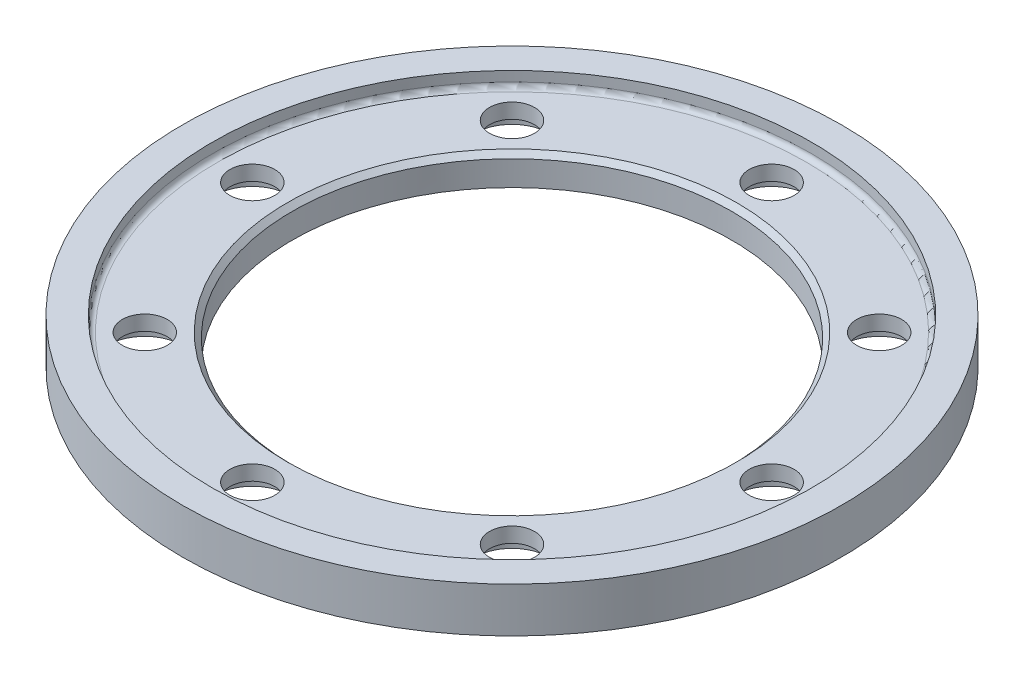
ISO-10303-21;
HEADER;
FILE_DESCRIPTION(('STEP AP214'),'2;1');
FILE_NAME('part.step','',(''),(''),'','','');
FILE_SCHEMA(('AUTOMOTIVE_DESIGN { 1 0 10303 214 1 1 1 1 }'));
ENDSEC;
DATA;
#1=APPLICATION_CONTEXT('core data for automotive mechanical design processes');
#2=APPLICATION_PROTOCOL_DEFINITION('international standard','automotive_design',2000,#1);
#3=PRODUCT_CONTEXT('',#1,'mechanical');
#4=PRODUCT('Part','Part','',(#3));
#5=PRODUCT_RELATED_PRODUCT_CATEGORY('part','',(#4));
#6=PRODUCT_DEFINITION_FORMATION('','',#4);
#7=PRODUCT_DEFINITION_CONTEXT('part definition',#1,'design');
#8=PRODUCT_DEFINITION('design','',#6,#7);
#9=PRODUCT_DEFINITION_SHAPE('','',#8);
#10=(LENGTH_UNIT() NAMED_UNIT(*) SI_UNIT(.MILLI.,.METRE.));
#11=(NAMED_UNIT(*) PLANE_ANGLE_UNIT() SI_UNIT($,.RADIAN.));
#12=(NAMED_UNIT(*) SI_UNIT($,.STERADIAN.) SOLID_ANGLE_UNIT());
#13=UNCERTAINTY_MEASURE_WITH_UNIT(LENGTH_MEASURE(1.E-05),#10,'distance_accuracy_value','');
#14=(GEOMETRIC_REPRESENTATION_CONTEXT(3) GLOBAL_UNCERTAINTY_ASSIGNED_CONTEXT((#13)) GLOBAL_UNIT_ASSIGNED_CONTEXT((#10,
#11,#12)) REPRESENTATION_CONTEXT('',''));
#15=CARTESIAN_POINT('',(0.,0.,0.));
#16=DIRECTION('',(0.,0.,1.));
#17=DIRECTION('',(1.,0.,0.));
#18=AXIS2_PLACEMENT_3D('',#15,#16,#17);
#19=CARTESIAN_POINT('',(22.,4.49999999999998,0.));
#20=DIRECTION('',(0.,1.,0.));
#21=DIRECTION('',(0.,0.,1.));
#22=AXIS2_PLACEMENT_3D('',#19,#20,#21);
#23=PLANE('',#22);
#24=CARTESIAN_POINT('',(0.,4.49999999999998,0.));
#25=DIRECTION('',(0.,1.,0.));
#26=DIRECTION('',(0.,0.,1.));
#27=AXIS2_PLACEMENT_3D('',#24,#25,#26);
#28=CIRCLE('',#27,33.);
#29=CARTESIAN_POINT('',(0.,4.49999999999998,33.));
#30=VERTEX_POINT('',#29);
#31=EDGE_CURVE('E109',#30,#30,#28,.T.);
#32=ORIENTED_EDGE('',*,*,#31,.F.);
#33=EDGE_LOOP('',(#32));
#34=FACE_BOUND('',#33,.T.);
#35=CARTESIAN_POINT('',(0.,4.49999999999998,0.));
#36=DIRECTION('',(0.,1.,0.));
#37=DIRECTION('',(0.,0.,1.));
#38=AXIS2_PLACEMENT_3D('',#35,#36,#37);
#39=CIRCLE('',#38,22.);
#40=CARTESIAN_POINT('',(0.,4.49999999999998,22.));
#41=VERTEX_POINT('',#40);
#42=EDGE_CURVE('E66',#41,#41,#39,.T.);
#43=ORIENTED_EDGE('',*,*,#42,.T.);
#44=EDGE_LOOP('',(#43));
#45=FACE_BOUND('',#44,.T.);
#46=CARTESIAN_POINT('',(18.3847763108463,4.49999999999998,-18.3847763108542));
#47=DIRECTION('',(0.,-1.,0.));
#48=DIRECTION('',(0.,0.,-1.));
#49=AXIS2_PLACEMENT_3D('',#46,#47,#48);
#50=CIRCLE('',#49,3.75);
#51=CARTESIAN_POINT('',(18.3847763108463,4.49999999999998,-22.1347763108542));
#52=VERTEX_POINT('',#51);
#53=EDGE_CURVE('E75',#52,#52,#50,.T.);
#54=ORIENTED_EDGE('',*,*,#53,.F.);
#55=EDGE_LOOP('',(#54));
#56=FACE_BOUND('',#55,.T.);
#57=CARTESIAN_POINT('',(26.,4.49999999999998,-4.81889118717568E-12));
#58=DIRECTION('',(0.,-1.,0.));
#59=DIRECTION('',(0.,0.,-1.));
#60=AXIS2_PLACEMENT_3D('',#57,#58,#59);
#61=CIRCLE('',#60,3.75);
#62=CARTESIAN_POINT('',(26.,4.49999999999998,-3.75000000000482));
#63=VERTEX_POINT('',#62);
#64=EDGE_CURVE('E80',#63,#63,#61,.T.);
#65=ORIENTED_EDGE('',*,*,#64,.F.);
#66=EDGE_LOOP('',(#65));
#67=FACE_BOUND('',#66,.T.);
#68=CARTESIAN_POINT('',(18.3847763108531,4.49999999999998,18.3847763108474));
#69=DIRECTION('',(0.,-1.,0.));
#70=DIRECTION('',(0.,0.,-1.));
#71=AXIS2_PLACEMENT_3D('',#68,#69,#70);
#72=CIRCLE('',#71,3.75);
#73=CARTESIAN_POINT('',(18.3847763108531,4.49999999999998,14.6347763108474));
#74=VERTEX_POINT('',#73);
#75=EDGE_CURVE('E85',#74,#74,#72,.T.);
#76=ORIENTED_EDGE('',*,*,#75,.F.);
#77=EDGE_LOOP('',(#76));
#78=FACE_BOUND('',#77,.T.);
#79=CARTESIAN_POINT('',(3.21554482361645E-12,4.49999999999998,26.));
#80=DIRECTION('',(0.,-1.,0.));
#81=DIRECTION('',(0.,0.,-1.));
#82=AXIS2_PLACEMENT_3D('',#79,#80,#81);
#83=CIRCLE('',#82,3.75);
#84=CARTESIAN_POINT('',(3.21554482361645E-12,4.49999999999998,22.25));
#85=VERTEX_POINT('',#84);
#86=EDGE_CURVE('E90',#85,#85,#83,.T.);
#87=ORIENTED_EDGE('',*,*,#86,.F.);
#88=EDGE_LOOP('',(#87));
#89=FACE_BOUND('',#88,.T.);
#90=CARTESIAN_POINT('',(-18.3847763108485,4.49999999999998,18.3847763108519));
#91=DIRECTION('',(0.,-1.,0.));
#92=DIRECTION('',(0.,0.,-1.));
#93=AXIS2_PLACEMENT_3D('',#90,#91,#92);
#94=CIRCLE('',#93,3.75);
#95=CARTESIAN_POINT('',(-18.3847763108485,4.49999999999998,14.6347763108519));
#96=VERTEX_POINT('',#95);
#97=EDGE_CURVE('E95',#96,#96,#94,.T.);
#98=ORIENTED_EDGE('',*,*,#97,.F.);
#99=EDGE_LOOP('',(#98));
#100=FACE_BOUND('',#99,.T.);
#101=CARTESIAN_POINT('',(-26.,4.49999999999998,1.60642530032916E-12));
#102=DIRECTION('',(0.,-1.,0.));
#103=DIRECTION('',(0.,0.,-1.));
#104=AXIS2_PLACEMENT_3D('',#101,#102,#103);
#105=CIRCLE('',#104,3.75);
#106=CARTESIAN_POINT('',(-26.,4.49999999999998,-3.74999999999839));
#107=VERTEX_POINT('',#106);
#108=EDGE_CURVE('E100',#107,#107,#105,.T.);
#109=ORIENTED_EDGE('',*,*,#108,.F.);
#110=EDGE_LOOP('',(#109));
#111=FACE_BOUND('',#110,.T.);
#112=CARTESIAN_POINT('',(-18.3847763108508,4.49999999999998,-18.3847763108497));
#113=DIRECTION('',(0.,-1.,0.));
#114=DIRECTION('',(0.,0.,-1.));
#115=AXIS2_PLACEMENT_3D('',#112,#113,#114);
#116=CIRCLE('',#115,3.75);
#117=CARTESIAN_POINT('',(-18.3847763108508,4.49999999999998,-22.1347763108497));
#118=VERTEX_POINT('',#117);
#119=EDGE_CURVE('E105',#118,#118,#116,.T.);
#120=ORIENTED_EDGE('',*,*,#119,.F.);
#121=EDGE_LOOP('',(#120));
#122=FACE_BOUND('',#121,.T.);
#123=CARTESIAN_POINT('',(0.,4.49999999999998,-26.));
#124=DIRECTION('',(0.,-1.,0.));
#125=DIRECTION('',(0.,0.,-1.));
#126=AXIS2_PLACEMENT_3D('',#123,#124,#125);
#127=CIRCLE('',#126,3.75);
#128=CARTESIAN_POINT('',(0.,4.49999999999998,-29.75));
#129=VERTEX_POINT('',#128);
#130=EDGE_CURVE('E171',#129,#129,#127,.T.);
#131=ORIENTED_EDGE('',*,*,#130,.F.);
#132=EDGE_LOOP('',(#131));
#133=FACE_BOUND('',#132,.T.);
#134=ADVANCED_FACE('F45',(#34,#45,#56,#67,#78,#89,#100,#111,#122,#133),#23,.F.);
#135=CARTESIAN_POINT('',(30.,7.49999999999998,0.));
#136=DIRECTION('',(0.,-1.,0.));
#137=DIRECTION('',(0.,0.,-1.));
#138=AXIS2_PLACEMENT_3D('',#135,#136,#137);
#139=PLANE('',#138);
#140=CARTESIAN_POINT('',(0.,7.49999999999998,0.));
#141=DIRECTION('',(0.,-1.,0.));
#142=DIRECTION('',(0.,0.,-1.));
#143=AXIS2_PLACEMENT_3D('',#140,#141,#142);
#144=CIRCLE('',#143,22.5);
#145=CARTESIAN_POINT('',(0.,7.49999999999998,-22.5));
#146=VERTEX_POINT('',#145);
#147=EDGE_CURVE('E10',#146,#146,#144,.T.);
#148=ORIENTED_EDGE('',*,*,#147,.T.);
#149=EDGE_LOOP('',(#148));
#150=FACE_BOUND('',#149,.T.);
#151=CARTESIAN_POINT('',(0.,7.49999999999998,0.));
#152=DIRECTION('',(0.,-1.,0.));
#153=DIRECTION('',(0.,0.,-1.));
#154=AXIS2_PLACEMENT_3D('',#151,#152,#153);
#155=CIRCLE('',#154,29.5);
#156=CARTESIAN_POINT('',(0.,7.49999999999998,-29.5));
#157=VERTEX_POINT('',#156);
#158=EDGE_CURVE('E61',#157,#157,#155,.F.);
#159=ORIENTED_EDGE('',*,*,#158,.T.);
#160=EDGE_LOOP('',(#159));
#161=FACE_BOUND('',#160,.T.);
#162=CARTESIAN_POINT('',(0.,7.49999999999998,-26.));
#163=DIRECTION('',(0.,-1.,0.));
#164=DIRECTION('',(0.,0.,-1.));
#165=AXIS2_PLACEMENT_3D('',#162,#163,#164);
#166=CIRCLE('',#165,2.25);
#167=CARTESIAN_POINT('',(0.,7.49999999999998,-28.25));
#168=VERTEX_POINT('',#167);
#169=EDGE_CURVE('E102',#168,#168,#166,.T.);
#170=ORIENTED_EDGE('',*,*,#169,.T.);
#171=EDGE_LOOP('',(#170));
#172=FACE_BOUND('',#171,.T.);
#173=CARTESIAN_POINT('',(-18.3847763108508,7.49999999999998,-18.3847763108497));
#174=DIRECTION('',(0.,-1.,0.));
#175=DIRECTION('',(0.,0.,-1.));
#176=AXIS2_PLACEMENT_3D('',#173,#174,#175);
#177=CIRCLE('',#176,2.25);
#178=CARTESIAN_POINT('',(-18.3847763108508,7.49999999999998,-20.6347763108497));
#179=VERTEX_POINT('',#178);
#180=EDGE_CURVE('E97',#179,#179,#177,.T.);
#181=ORIENTED_EDGE('',*,*,#180,.T.);
#182=EDGE_LOOP('',(#181));
#183=FACE_BOUND('',#182,.T.);
#184=CARTESIAN_POINT('',(-26.,7.49999999999998,1.60642530032916E-12));
#185=DIRECTION('',(0.,-1.,0.));
#186=DIRECTION('',(0.,0.,-1.));
#187=AXIS2_PLACEMENT_3D('',#184,#185,#186);
#188=CIRCLE('',#187,2.25);
#189=CARTESIAN_POINT('',(-26.,7.49999999999998,-2.24999999999839));
#190=VERTEX_POINT('',#189);
#191=EDGE_CURVE('E92',#190,#190,#188,.T.);
#192=ORIENTED_EDGE('',*,*,#191,.T.);
#193=EDGE_LOOP('',(#192));
#194=FACE_BOUND('',#193,.T.);
#195=CARTESIAN_POINT('',(-18.3847763108485,7.49999999999998,18.3847763108519));
#196=DIRECTION('',(0.,-1.,0.));
#197=DIRECTION('',(0.,0.,-1.));
#198=AXIS2_PLACEMENT_3D('',#195,#196,#197);
#199=CIRCLE('',#198,2.25);
#200=CARTESIAN_POINT('',(-18.3847763108485,7.49999999999998,16.1347763108519));
#201=VERTEX_POINT('',#200);
#202=EDGE_CURVE('E87',#201,#201,#199,.T.);
#203=ORIENTED_EDGE('',*,*,#202,.T.);
#204=EDGE_LOOP('',(#203));
#205=FACE_BOUND('',#204,.T.);
#206=CARTESIAN_POINT('',(3.21554482361645E-12,7.49999999999998,26.));
#207=DIRECTION('',(0.,-1.,0.));
#208=DIRECTION('',(0.,0.,-1.));
#209=AXIS2_PLACEMENT_3D('',#206,#207,#208);
#210=CIRCLE('',#209,2.25);
#211=CARTESIAN_POINT('',(3.21554482361645E-12,7.49999999999998,23.75));
#212=VERTEX_POINT('',#211);
#213=EDGE_CURVE('E82',#212,#212,#210,.T.);
#214=ORIENTED_EDGE('',*,*,#213,.T.);
#215=EDGE_LOOP('',(#214));
#216=FACE_BOUND('',#215,.T.);
#217=CARTESIAN_POINT('',(18.3847763108531,7.49999999999998,18.3847763108474));
#218=DIRECTION('',(0.,-1.,0.));
#219=DIRECTION('',(0.,0.,-1.));
#220=AXIS2_PLACEMENT_3D('',#217,#218,#219);
#221=CIRCLE('',#220,2.25);
#222=CARTESIAN_POINT('',(18.3847763108531,7.49999999999998,16.1347763108474));
#223=VERTEX_POINT('',#222);
#224=EDGE_CURVE('E77',#223,#223,#221,.T.);
#225=ORIENTED_EDGE('',*,*,#224,.T.);
#226=EDGE_LOOP('',(#225));
#227=FACE_BOUND('',#226,.T.);
#228=CARTESIAN_POINT('',(26.,7.49999999999998,-4.81889118717568E-12));
#229=DIRECTION('',(0.,-1.,0.));
#230=DIRECTION('',(0.,0.,-1.));
#231=AXIS2_PLACEMENT_3D('',#228,#229,#230);
#232=CIRCLE('',#231,2.25);
#233=CARTESIAN_POINT('',(26.,7.49999999999998,-2.25000000000482));
#234=VERTEX_POINT('',#233);
#235=EDGE_CURVE('E72',#234,#234,#232,.T.);
#236=ORIENTED_EDGE('',*,*,#235,.T.);
#237=EDGE_LOOP('',(#236));
#238=FACE_BOUND('',#237,.T.);
#239=CARTESIAN_POINT('',(18.3847763108463,7.49999999999998,-18.3847763108542));
#240=DIRECTION('',(0.,-1.,0.));
#241=DIRECTION('',(0.,0.,-1.));
#242=AXIS2_PLACEMENT_3D('',#239,#240,#241);
#243=CIRCLE('',#242,2.25);
#244=CARTESIAN_POINT('',(18.3847763108463,7.49999999999998,-20.6347763108542));
#245=VERTEX_POINT('',#244);
#246=EDGE_CURVE('E67',#245,#245,#243,.T.);
#247=ORIENTED_EDGE('',*,*,#246,.T.);
#248=EDGE_LOOP('',(#247));
#249=FACE_BOUND('',#248,.T.);
#250=ADVANCED_FACE('F178',(#150,#161,#172,#183,#194,#205,#216,#227,#238,#249),#139,.F.);
#251=CARTESIAN_POINT('',(0.,182.378600126775,0.));
#252=DIRECTION('',(0.,1.,0.));
#253=DIRECTION('',(0.,0.,1.));
#254=AXIS2_PLACEMENT_3D('',#251,#252,#253);
#255=CYLINDRICAL_SURFACE('',#254,22.);
#256=CARTESIAN_POINT('',(0.,6.99999999999995,0.));
#257=DIRECTION('',(0.,-1.,0.));
#258=DIRECTION('',(0.,0.,-1.));
#259=AXIS2_PLACEMENT_3D('',#256,#257,#258);
#260=CIRCLE('',#259,22.);
#261=CARTESIAN_POINT('',(0.,6.99999999999995,-22.));
#262=VERTEX_POINT('',#261);
#263=EDGE_CURVE('E53',#262,#262,#260,.F.);
#264=ORIENTED_EDGE('',*,*,#263,.T.);
#265=EDGE_LOOP('',(#264));
#266=FACE_BOUND('',#265,.T.);
#267=ORIENTED_EDGE('',*,*,#42,.F.);
#268=EDGE_LOOP('',(#267));
#269=FACE_BOUND('',#268,.T.);
#270=ADVANCED_FACE('F186',(#266,#269),#255,.F.);
#271=CARTESIAN_POINT('',(0.,182.378600126775,0.));
#272=DIRECTION('',(0.,1.,0.));
#273=DIRECTION('',(0.,0.,1.));
#274=AXIS2_PLACEMENT_3D('',#271,#272,#273);
#275=CYLINDRICAL_SURFACE('',#274,33.);
#276=CARTESIAN_POINT('',(0.,8.99999999999998,0.));
#277=DIRECTION('',(0.,1.,0.));
#278=DIRECTION('',(0.,0.,1.));
#279=AXIS2_PLACEMENT_3D('',#276,#277,#278);
#280=CIRCLE('',#279,33.);
#281=CARTESIAN_POINT('',(0.,8.99999999999998,33.));
#282=VERTEX_POINT('',#281);
#283=EDGE_CURVE('E112',#282,#282,#280,.T.);
#284=ORIENTED_EDGE('',*,*,#283,.F.);
#285=EDGE_LOOP('',(#284));
#286=FACE_BOUND('',#285,.T.);
#287=ORIENTED_EDGE('',*,*,#31,.T.);
#288=EDGE_LOOP('',(#287));
#289=FACE_BOUND('',#288,.T.);
#290=ADVANCED_FACE('F192',(#286,#289),#275,.T.);
#291=CARTESIAN_POINT('',(33.,8.99999999999998,0.));
#292=DIRECTION('',(0.,-1.,0.));
#293=DIRECTION('',(0.,0.,-1.));
#294=AXIS2_PLACEMENT_3D('',#291,#292,#293);
#295=PLANE('',#294);
#296=CARTESIAN_POINT('',(0.,8.99999999999998,0.));
#297=DIRECTION('',(0.,1.,0.));
#298=DIRECTION('',(0.,0.,1.));
#299=AXIS2_PLACEMENT_3D('',#296,#297,#298);
#300=CIRCLE('',#299,30.);
#301=CARTESIAN_POINT('',(0.,8.99999999999998,30.));
#302=VERTEX_POINT('',#301);
#303=EDGE_CURVE('E70',#302,#302,#300,.T.);
#304=ORIENTED_EDGE('',*,*,#303,.F.);
#305=EDGE_LOOP('',(#304));
#306=FACE_BOUND('',#305,.T.);
#307=ORIENTED_EDGE('',*,*,#283,.T.);
#308=EDGE_LOOP('',(#307));
#309=FACE_BOUND('',#308,.T.);
#310=ADVANCED_FACE('F343',(#306,#309),#295,.F.);
#311=CARTESIAN_POINT('',(0.,182.378600126775,0.));
#312=DIRECTION('',(0.,1.,0.));
#313=DIRECTION('',(0.,0.,1.));
#314=AXIS2_PLACEMENT_3D('',#311,#312,#313);
#315=CYLINDRICAL_SURFACE('',#314,30.);
#316=CARTESIAN_POINT('',(0.,7.99999999999998,0.));
#317=DIRECTION('',(0.,-1.,0.));
#318=DIRECTION('',(0.,0.,-1.));
#319=AXIS2_PLACEMENT_3D('',#316,#317,#318);
#320=CIRCLE('',#319,30.);
#321=CARTESIAN_POINT('',(0.,7.99999999999998,-30.));
#322=VERTEX_POINT('',#321);
#323=EDGE_CURVE('E57',#322,#322,#320,.T.);
#324=ORIENTED_EDGE('',*,*,#323,.T.);
#325=EDGE_LOOP('',(#324));
#326=FACE_BOUND('',#325,.T.);
#327=ORIENTED_EDGE('',*,*,#303,.T.);
#328=EDGE_LOOP('',(#327));
#329=FACE_BOUND('',#328,.T.);
#330=ADVANCED_FACE('F232',(#326,#329),#315,.F.);
#331=CARTESIAN_POINT('',(18.3847763108463,4.49999999999998,-18.3847763108542));
#332=DIRECTION('',(0.,-1.,0.));
#333=DIRECTION('',(0.,0.,-1.));
#334=AXIS2_PLACEMENT_3D('',#331,#332,#333);
#335=CYLINDRICAL_SURFACE('',#334,2.25);
#336=ORIENTED_EDGE('',*,*,#246,.F.);
#337=EDGE_LOOP('',(#336));
#338=FACE_BOUND('',#337,.T.);
#339=CARTESIAN_POINT('',(18.3847763108463,5.99999999999998,-18.3847763108542));
#340=DIRECTION('',(0.,-1.,0.));
#341=DIRECTION('',(0.,0.,-1.));
#342=AXIS2_PLACEMENT_3D('',#339,#340,#341);
#343=CIRCLE('',#342,2.25);
#344=CARTESIAN_POINT('',(18.3847763108463,5.99999999999998,-20.6347763108542));
#345=VERTEX_POINT('',#344);
#346=EDGE_CURVE('E71',#345,#345,#343,.T.);
#347=ORIENTED_EDGE('',*,*,#346,.T.);
#348=EDGE_LOOP('',(#347));
#349=FACE_BOUND('',#348,.T.);
#350=ADVANCED_FACE('F228',(#338,#349),#335,.F.);
#351=CARTESIAN_POINT('',(20.6347763108463,5.99999999999998,-18.3847763108542));
#352=DIRECTION('',(0.,1.,0.));
#353=DIRECTION('',(0.,0.,1.));
#354=AXIS2_PLACEMENT_3D('',#351,#352,#353);
#355=PLANE('',#354);
#356=ORIENTED_EDGE('',*,*,#346,.F.);
#357=EDGE_LOOP('',(#356));
#358=FACE_BOUND('',#357,.T.);
#359=CARTESIAN_POINT('',(18.3847763108463,5.99999999999998,-18.3847763108542));
#360=DIRECTION('',(0.,-1.,0.));
#361=DIRECTION('',(0.,0.,-1.));
#362=AXIS2_PLACEMENT_3D('',#359,#360,#361);
#363=CIRCLE('',#362,3.75);
#364=CARTESIAN_POINT('',(18.3847763108463,5.99999999999998,-22.1347763108542));
#365=VERTEX_POINT('',#364);
#366=EDGE_CURVE('E119',#365,#365,#363,.T.);
#367=ORIENTED_EDGE('',*,*,#366,.T.);
#368=EDGE_LOOP('',(#367));
#369=FACE_BOUND('',#368,.T.);
#370=ADVANCED_FACE('F231',(#358,#369),#355,.F.);
#371=CARTESIAN_POINT('',(18.3847763108463,4.49999999999998,-18.3847763108542));
#372=DIRECTION('',(0.,-1.,0.));
#373=DIRECTION('',(0.,0.,-1.));
#374=AXIS2_PLACEMENT_3D('',#371,#372,#373);
#375=CYLINDRICAL_SURFACE('',#374,3.75);
#376=ORIENTED_EDGE('',*,*,#366,.F.);
#377=EDGE_LOOP('',(#376));
#378=FACE_BOUND('',#377,.T.);
#379=ORIENTED_EDGE('',*,*,#53,.T.);
#380=EDGE_LOOP('',(#379));
#381=FACE_BOUND('',#380,.T.);
#382=ADVANCED_FACE('F238',(#378,#381),#375,.F.);
#383=CARTESIAN_POINT('',(26.,4.49999999999998,-4.81889118717568E-12));
#384=DIRECTION('',(0.,-1.,0.));
#385=DIRECTION('',(0.,0.,-1.));
#386=AXIS2_PLACEMENT_3D('',#383,#384,#385);
#387=CYLINDRICAL_SURFACE('',#386,2.25);
#388=ORIENTED_EDGE('',*,*,#235,.F.);
#389=EDGE_LOOP('',(#388));
#390=FACE_BOUND('',#389,.T.);
#391=CARTESIAN_POINT('',(26.,5.99999999999998,-4.81889118717568E-12));
#392=DIRECTION('',(0.,-1.,0.));
#393=DIRECTION('',(0.,0.,-1.));
#394=AXIS2_PLACEMENT_3D('',#391,#392,#393);
#395=CIRCLE('',#394,2.25);
#396=CARTESIAN_POINT('',(26.,5.99999999999998,-2.25000000000482));
#397=VERTEX_POINT('',#396);
#398=EDGE_CURVE('E76',#397,#397,#395,.T.);
#399=ORIENTED_EDGE('',*,*,#398,.T.);
#400=EDGE_LOOP('',(#399));
#401=FACE_BOUND('',#400,.T.);
#402=ADVANCED_FACE('F244',(#390,#401),#387,.F.);
#403=CARTESIAN_POINT('',(28.25,5.99999999999998,-4.81889118717568E-12));
#404=DIRECTION('',(0.,1.,0.));
#405=DIRECTION('',(0.,0.,1.));
#406=AXIS2_PLACEMENT_3D('',#403,#404,#405);
#407=PLANE('',#406);
#408=ORIENTED_EDGE('',*,*,#398,.F.);
#409=EDGE_LOOP('',(#408));
#410=FACE_BOUND('',#409,.T.);
#411=CARTESIAN_POINT('',(26.,5.99999999999998,-4.81889118717568E-12));
#412=DIRECTION('',(0.,-1.,0.));
#413=DIRECTION('',(0.,0.,-1.));
#414=AXIS2_PLACEMENT_3D('',#411,#412,#413);
#415=CIRCLE('',#414,3.75);
#416=CARTESIAN_POINT('',(26.,5.99999999999998,-3.75000000000482));
#417=VERTEX_POINT('',#416);
#418=EDGE_CURVE('E126',#417,#417,#415,.T.);
#419=ORIENTED_EDGE('',*,*,#418,.T.);
#420=EDGE_LOOP('',(#419));
#421=FACE_BOUND('',#420,.T.);
#422=ADVANCED_FACE('F334',(#410,#421),#407,.F.);
#423=CARTESIAN_POINT('',(26.,4.49999999999998,-4.81889118717568E-12));
#424=DIRECTION('',(0.,-1.,0.));
#425=DIRECTION('',(0.,0.,-1.));
#426=AXIS2_PLACEMENT_3D('',#423,#424,#425);
#427=CYLINDRICAL_SURFACE('',#426,3.75);
#428=ORIENTED_EDGE('',*,*,#418,.F.);
#429=EDGE_LOOP('',(#428));
#430=FACE_BOUND('',#429,.T.);
#431=ORIENTED_EDGE('',*,*,#64,.T.);
#432=EDGE_LOOP('',(#431));
#433=FACE_BOUND('',#432,.T.);
#434=ADVANCED_FACE('F330',(#430,#433),#427,.F.);
#435=CARTESIAN_POINT('',(18.3847763108531,4.49999999999998,18.3847763108474));
#436=DIRECTION('',(0.,-1.,0.));
#437=DIRECTION('',(0.,0.,-1.));
#438=AXIS2_PLACEMENT_3D('',#435,#436,#437);
#439=CYLINDRICAL_SURFACE('',#438,2.25);
#440=ORIENTED_EDGE('',*,*,#224,.F.);
#441=EDGE_LOOP('',(#440));
#442=FACE_BOUND('',#441,.T.);
#443=CARTESIAN_POINT('',(18.3847763108531,5.99999999999998,18.3847763108474));
#444=DIRECTION('',(0.,-1.,0.));
#445=DIRECTION('',(0.,0.,-1.));
#446=AXIS2_PLACEMENT_3D('',#443,#444,#445);
#447=CIRCLE('',#446,2.25);
#448=CARTESIAN_POINT('',(18.3847763108531,5.99999999999998,16.1347763108474));
#449=VERTEX_POINT('',#448);
#450=EDGE_CURVE('E81',#449,#449,#447,.T.);
#451=ORIENTED_EDGE('',*,*,#450,.T.);
#452=EDGE_LOOP('',(#451));
#453=FACE_BOUND('',#452,.T.);
#454=ADVANCED_FACE('F326',(#442,#453),#439,.F.);
#455=CARTESIAN_POINT('',(20.6347763108531,5.99999999999998,18.3847763108474));
#456=DIRECTION('',(0.,1.,0.));
#457=DIRECTION('',(0.,0.,1.));
#458=AXIS2_PLACEMENT_3D('',#455,#456,#457);
#459=PLANE('',#458);
#460=ORIENTED_EDGE('',*,*,#450,.F.);
#461=EDGE_LOOP('',(#460));
#462=FACE_BOUND('',#461,.T.);
#463=CARTESIAN_POINT('',(18.3847763108531,5.99999999999998,18.3847763108474));
#464=DIRECTION('',(0.,-1.,0.));
#465=DIRECTION('',(0.,0.,-1.));
#466=AXIS2_PLACEMENT_3D('',#463,#464,#465);
#467=CIRCLE('',#466,3.75);
#468=CARTESIAN_POINT('',(18.3847763108531,5.99999999999998,14.6347763108474));
#469=VERTEX_POINT('',#468);
#470=EDGE_CURVE('E133',#469,#469,#467,.T.);
#471=ORIENTED_EDGE('',*,*,#470,.T.);
#472=EDGE_LOOP('',(#471));
#473=FACE_BOUND('',#472,.T.);
#474=ADVANCED_FACE('F322',(#462,#473),#459,.F.);
#475=CARTESIAN_POINT('',(18.3847763108531,4.49999999999998,18.3847763108474));
#476=DIRECTION('',(0.,-1.,0.));
#477=DIRECTION('',(0.,0.,-1.));
#478=AXIS2_PLACEMENT_3D('',#475,#476,#477);
#479=CYLINDRICAL_SURFACE('',#478,3.75);
#480=ORIENTED_EDGE('',*,*,#470,.F.);
#481=EDGE_LOOP('',(#480));
#482=FACE_BOUND('',#481,.T.);
#483=ORIENTED_EDGE('',*,*,#75,.T.);
#484=EDGE_LOOP('',(#483));
#485=FACE_BOUND('',#484,.T.);
#486=ADVANCED_FACE('F318',(#482,#485),#479,.F.);
#487=CARTESIAN_POINT('',(3.21554482361645E-12,4.49999999999998,26.));
#488=DIRECTION('',(0.,-1.,0.));
#489=DIRECTION('',(0.,0.,-1.));
#490=AXIS2_PLACEMENT_3D('',#487,#488,#489);
#491=CYLINDRICAL_SURFACE('',#490,2.25);
#492=ORIENTED_EDGE('',*,*,#213,.F.);
#493=EDGE_LOOP('',(#492));
#494=FACE_BOUND('',#493,.T.);
#495=CARTESIAN_POINT('',(3.21554482361645E-12,5.99999999999998,26.));
#496=DIRECTION('',(0.,-1.,0.));
#497=DIRECTION('',(0.,0.,-1.));
#498=AXIS2_PLACEMENT_3D('',#495,#496,#497);
#499=CIRCLE('',#498,2.25);
#500=CARTESIAN_POINT('',(3.21554482361645E-12,5.99999999999998,23.75));
#501=VERTEX_POINT('',#500);
#502=EDGE_CURVE('E86',#501,#501,#499,.T.);
#503=ORIENTED_EDGE('',*,*,#502,.T.);
#504=EDGE_LOOP('',(#503));
#505=FACE_BOUND('',#504,.T.);
#506=ADVANCED_FACE('F314',(#494,#505),#491,.F.);
#507=CARTESIAN_POINT('',(2.25000000000322,5.99999999999998,26.));
#508=DIRECTION('',(0.,1.,0.));
#509=DIRECTION('',(0.,0.,1.));
#510=AXIS2_PLACEMENT_3D('',#507,#508,#509);
#511=PLANE('',#510);
#512=ORIENTED_EDGE('',*,*,#502,.F.);
#513=EDGE_LOOP('',(#512));
#514=FACE_BOUND('',#513,.T.);
#515=CARTESIAN_POINT('',(3.21554482361645E-12,5.99999999999998,26.));
#516=DIRECTION('',(0.,-1.,0.));
#517=DIRECTION('',(0.,0.,-1.));
#518=AXIS2_PLACEMENT_3D('',#515,#516,#517);
#519=CIRCLE('',#518,3.75);
#520=CARTESIAN_POINT('',(3.21554482361645E-12,5.99999999999998,22.25));
#521=VERTEX_POINT('',#520);
#522=EDGE_CURVE('E140',#521,#521,#519,.T.);
#523=ORIENTED_EDGE('',*,*,#522,.T.);
#524=EDGE_LOOP('',(#523));
#525=FACE_BOUND('',#524,.T.);
#526=ADVANCED_FACE('F310',(#514,#525),#511,.F.);
#527=CARTESIAN_POINT('',(3.21554482361645E-12,4.49999999999998,26.));
#528=DIRECTION('',(0.,-1.,0.));
#529=DIRECTION('',(0.,0.,-1.));
#530=AXIS2_PLACEMENT_3D('',#527,#528,#529);
#531=CYLINDRICAL_SURFACE('',#530,3.75);
#532=ORIENTED_EDGE('',*,*,#522,.F.);
#533=EDGE_LOOP('',(#532));
#534=FACE_BOUND('',#533,.T.);
#535=ORIENTED_EDGE('',*,*,#86,.T.);
#536=EDGE_LOOP('',(#535));
#537=FACE_BOUND('',#536,.T.);
#538=ADVANCED_FACE('F306',(#534,#537),#531,.F.);
#539=CARTESIAN_POINT('',(-18.3847763108485,4.49999999999998,18.3847763108519));
#540=DIRECTION('',(0.,-1.,0.));
#541=DIRECTION('',(0.,0.,-1.));
#542=AXIS2_PLACEMENT_3D('',#539,#540,#541);
#543=CYLINDRICAL_SURFACE('',#542,2.25);
#544=ORIENTED_EDGE('',*,*,#202,.F.);
#545=EDGE_LOOP('',(#544));
#546=FACE_BOUND('',#545,.T.);
#547=CARTESIAN_POINT('',(-18.3847763108485,5.99999999999998,18.3847763108519));
#548=DIRECTION('',(0.,-1.,0.));
#549=DIRECTION('',(0.,0.,-1.));
#550=AXIS2_PLACEMENT_3D('',#547,#548,#549);
#551=CIRCLE('',#550,2.25);
#552=CARTESIAN_POINT('',(-18.3847763108485,5.99999999999998,16.1347763108519));
#553=VERTEX_POINT('',#552);
#554=EDGE_CURVE('E91',#553,#553,#551,.T.);
#555=ORIENTED_EDGE('',*,*,#554,.T.);
#556=EDGE_LOOP('',(#555));
#557=FACE_BOUND('',#556,.T.);
#558=ADVANCED_FACE('F302',(#546,#557),#543,.F.);
#559=CARTESIAN_POINT('',(-16.1347763108485,5.99999999999998,18.3847763108519));
#560=DIRECTION('',(0.,1.,0.));
#561=DIRECTION('',(0.,0.,1.));
#562=AXIS2_PLACEMENT_3D('',#559,#560,#561);
#563=PLANE('',#562);
#564=ORIENTED_EDGE('',*,*,#554,.F.);
#565=EDGE_LOOP('',(#564));
#566=FACE_BOUND('',#565,.T.);
#567=CARTESIAN_POINT('',(-18.3847763108485,5.99999999999998,18.3847763108519));
#568=DIRECTION('',(0.,-1.,0.));
#569=DIRECTION('',(0.,0.,-1.));
#570=AXIS2_PLACEMENT_3D('',#567,#568,#569);
#571=CIRCLE('',#570,3.75);
#572=CARTESIAN_POINT('',(-18.3847763108485,5.99999999999998,14.6347763108519));
#573=VERTEX_POINT('',#572);
#574=EDGE_CURVE('E147',#573,#573,#571,.T.);
#575=ORIENTED_EDGE('',*,*,#574,.T.);
#576=EDGE_LOOP('',(#575));
#577=FACE_BOUND('',#576,.T.);
#578=ADVANCED_FACE('F298',(#566,#577),#563,.F.);
#579=CARTESIAN_POINT('',(-18.3847763108485,4.49999999999998,18.3847763108519));
#580=DIRECTION('',(0.,-1.,0.));
#581=DIRECTION('',(0.,0.,-1.));
#582=AXIS2_PLACEMENT_3D('',#579,#580,#581);
#583=CYLINDRICAL_SURFACE('',#582,3.75);
#584=ORIENTED_EDGE('',*,*,#574,.F.);
#585=EDGE_LOOP('',(#584));
#586=FACE_BOUND('',#585,.T.);
#587=ORIENTED_EDGE('',*,*,#97,.T.);
#588=EDGE_LOOP('',(#587));
#589=FACE_BOUND('',#588,.T.);
#590=ADVANCED_FACE('F294',(#586,#589),#583,.F.);
#591=CARTESIAN_POINT('',(-26.,4.49999999999998,1.60642530032916E-12));
#592=DIRECTION('',(0.,-1.,0.));
#593=DIRECTION('',(0.,0.,-1.));
#594=AXIS2_PLACEMENT_3D('',#591,#592,#593);
#595=CYLINDRICAL_SURFACE('',#594,2.25);
#596=ORIENTED_EDGE('',*,*,#191,.F.);
#597=EDGE_LOOP('',(#596));
#598=FACE_BOUND('',#597,.T.);
#599=CARTESIAN_POINT('',(-26.,5.99999999999998,1.60642530032916E-12));
#600=DIRECTION('',(0.,-1.,0.));
#601=DIRECTION('',(0.,0.,-1.));
#602=AXIS2_PLACEMENT_3D('',#599,#600,#601);
#603=CIRCLE('',#602,2.25);
#604=CARTESIAN_POINT('',(-26.,5.99999999999998,-2.2499999999984));
#605=VERTEX_POINT('',#604);
#606=EDGE_CURVE('E96',#605,#605,#603,.T.);
#607=ORIENTED_EDGE('',*,*,#606,.T.);
#608=EDGE_LOOP('',(#607));
#609=FACE_BOUND('',#608,.T.);
#610=ADVANCED_FACE('F290',(#598,#609),#595,.F.);
#611=CARTESIAN_POINT('',(-23.75,5.99999999999998,1.60642530032916E-12));
#612=DIRECTION('',(0.,1.,0.));
#613=DIRECTION('',(0.,0.,1.));
#614=AXIS2_PLACEMENT_3D('',#611,#612,#613);
#615=PLANE('',#614);
#616=ORIENTED_EDGE('',*,*,#606,.F.);
#617=EDGE_LOOP('',(#616));
#618=FACE_BOUND('',#617,.T.);
#619=CARTESIAN_POINT('',(-26.,5.99999999999998,1.60642530032916E-12));
#620=DIRECTION('',(0.,-1.,0.));
#621=DIRECTION('',(0.,0.,-1.));
#622=AXIS2_PLACEMENT_3D('',#619,#620,#621);
#623=CIRCLE('',#622,3.75);
#624=CARTESIAN_POINT('',(-26.,5.99999999999998,-3.74999999999839));
#625=VERTEX_POINT('',#624);
#626=EDGE_CURVE('E154',#625,#625,#623,.T.);
#627=ORIENTED_EDGE('',*,*,#626,.T.);
#628=EDGE_LOOP('',(#627));
#629=FACE_BOUND('',#628,.T.);
#630=ADVANCED_FACE('F286',(#618,#629),#615,.F.);
#631=CARTESIAN_POINT('',(-26.,4.49999999999998,1.60642530032916E-12));
#632=DIRECTION('',(0.,-1.,0.));
#633=DIRECTION('',(0.,0.,-1.));
#634=AXIS2_PLACEMENT_3D('',#631,#632,#633);
#635=CYLINDRICAL_SURFACE('',#634,3.75);
#636=ORIENTED_EDGE('',*,*,#626,.F.);
#637=EDGE_LOOP('',(#636));
#638=FACE_BOUND('',#637,.T.);
#639=ORIENTED_EDGE('',*,*,#108,.T.);
#640=EDGE_LOOP('',(#639));
#641=FACE_BOUND('',#640,.T.);
#642=ADVANCED_FACE('F282',(#638,#641),#635,.F.);
#643=CARTESIAN_POINT('',(-18.3847763108508,4.49999999999998,-18.3847763108497));
#644=DIRECTION('',(0.,-1.,0.));
#645=DIRECTION('',(0.,0.,-1.));
#646=AXIS2_PLACEMENT_3D('',#643,#644,#645);
#647=CYLINDRICAL_SURFACE('',#646,2.25);
#648=ORIENTED_EDGE('',*,*,#180,.F.);
#649=EDGE_LOOP('',(#648));
#650=FACE_BOUND('',#649,.T.);
#651=CARTESIAN_POINT('',(-18.3847763108508,5.99999999999998,-18.3847763108497));
#652=DIRECTION('',(0.,-1.,0.));
#653=DIRECTION('',(0.,0.,-1.));
#654=AXIS2_PLACEMENT_3D('',#651,#652,#653);
#655=CIRCLE('',#654,2.25);
#656=CARTESIAN_POINT('',(-18.3847763108508,5.99999999999998,-20.6347763108497));
#657=VERTEX_POINT('',#656);
#658=EDGE_CURVE('E101',#657,#657,#655,.T.);
#659=ORIENTED_EDGE('',*,*,#658,.T.);
#660=EDGE_LOOP('',(#659));
#661=FACE_BOUND('',#660,.T.);
#662=ADVANCED_FACE('F274',(#650,#661),#647,.F.);
#663=CARTESIAN_POINT('',(-16.1347763108508,5.99999999999998,-18.3847763108497));
#664=DIRECTION('',(0.,1.,0.));
#665=DIRECTION('',(0.,0.,1.));
#666=AXIS2_PLACEMENT_3D('',#663,#664,#665);
#667=PLANE('',#666);
#668=ORIENTED_EDGE('',*,*,#658,.F.);
#669=EDGE_LOOP('',(#668));
#670=FACE_BOUND('',#669,.T.);
#671=CARTESIAN_POINT('',(-18.3847763108508,5.99999999999998,-18.3847763108497));
#672=DIRECTION('',(0.,-1.,0.));
#673=DIRECTION('',(0.,0.,-1.));
#674=AXIS2_PLACEMENT_3D('',#671,#672,#673);
#675=CIRCLE('',#674,3.75);
#676=CARTESIAN_POINT('',(-18.3847763108508,5.99999999999998,-22.1347763108497));
#677=VERTEX_POINT('',#676);
#678=EDGE_CURVE('E161',#677,#677,#675,.T.);
#679=ORIENTED_EDGE('',*,*,#678,.T.);
#680=EDGE_LOOP('',(#679));
#681=FACE_BOUND('',#680,.T.);
#682=ADVANCED_FACE('F264',(#670,#681),#667,.F.);
#683=CARTESIAN_POINT('',(-18.3847763108508,4.49999999999998,-18.3847763108497));
#684=DIRECTION('',(0.,-1.,0.));
#685=DIRECTION('',(0.,0.,-1.));
#686=AXIS2_PLACEMENT_3D('',#683,#684,#685);
#687=CYLINDRICAL_SURFACE('',#686,3.75);
#688=ORIENTED_EDGE('',*,*,#678,.F.);
#689=EDGE_LOOP('',(#688));
#690=FACE_BOUND('',#689,.T.);
#691=ORIENTED_EDGE('',*,*,#119,.T.);
#692=EDGE_LOOP('',(#691));
#693=FACE_BOUND('',#692,.T.);
#694=ADVANCED_FACE('F261',(#690,#693),#687,.F.);
#695=CARTESIAN_POINT('',(0.,4.49999999999998,-26.));
#696=DIRECTION('',(0.,-1.,0.));
#697=DIRECTION('',(0.,0.,-1.));
#698=AXIS2_PLACEMENT_3D('',#695,#696,#697);
#699=CYLINDRICAL_SURFACE('',#698,2.25);
#700=ORIENTED_EDGE('',*,*,#169,.F.);
#701=EDGE_LOOP('',(#700));
#702=FACE_BOUND('',#701,.T.);
#703=CARTESIAN_POINT('',(0.,5.99999999999998,-26.));
#704=DIRECTION('',(0.,-1.,0.));
#705=DIRECTION('',(0.,0.,-1.));
#706=AXIS2_PLACEMENT_3D('',#703,#704,#705);
#707=CIRCLE('',#706,2.25);
#708=CARTESIAN_POINT('',(0.,5.99999999999998,-28.25));
#709=VERTEX_POINT('',#708);
#710=EDGE_CURVE('E106',#709,#709,#707,.T.);
#711=ORIENTED_EDGE('',*,*,#710,.T.);
#712=EDGE_LOOP('',(#711));
#713=FACE_BOUND('',#712,.T.);
#714=ADVANCED_FACE('F263',(#702,#713),#699,.F.);
#715=CARTESIAN_POINT('',(2.25,5.99999999999998,-26.));
#716=DIRECTION('',(0.,1.,0.));
#717=DIRECTION('',(0.,0.,1.));
#718=AXIS2_PLACEMENT_3D('',#715,#716,#717);
#719=PLANE('',#718);
#720=ORIENTED_EDGE('',*,*,#710,.F.);
#721=EDGE_LOOP('',(#720));
#722=FACE_BOUND('',#721,.T.);
#723=CARTESIAN_POINT('',(0.,5.99999999999998,-26.));
#724=DIRECTION('',(0.,-1.,0.));
#725=DIRECTION('',(0.,0.,-1.));
#726=AXIS2_PLACEMENT_3D('',#723,#724,#725);
#727=CIRCLE('',#726,3.75);
#728=CARTESIAN_POINT('',(0.,5.99999999999998,-29.75));
#729=VERTEX_POINT('',#728);
#730=EDGE_CURVE('E168',#729,#729,#727,.T.);
#731=ORIENTED_EDGE('',*,*,#730,.T.);
#732=EDGE_LOOP('',(#731));
#733=FACE_BOUND('',#732,.T.);
#734=ADVANCED_FACE('F204',(#722,#733),#719,.F.);
#735=CARTESIAN_POINT('',(0.,4.49999999999998,-26.));
#736=DIRECTION('',(0.,-1.,0.));
#737=DIRECTION('',(0.,0.,-1.));
#738=AXIS2_PLACEMENT_3D('',#735,#736,#737);
#739=CYLINDRICAL_SURFACE('',#738,3.75);
#740=ORIENTED_EDGE('',*,*,#730,.F.);
#741=EDGE_LOOP('',(#740));
#742=FACE_BOUND('',#741,.T.);
#743=ORIENTED_EDGE('',*,*,#130,.T.);
#744=EDGE_LOOP('',(#743));
#745=FACE_BOUND('',#744,.T.);
#746=ADVANCED_FACE('F175',(#742,#745),#739,.F.);
#747=CARTESIAN_POINT('',(0.,7.99999999999998,0.));
#748=DIRECTION('',(0.,-1.,0.));
#749=DIRECTION('',(0.,0.,-1.));
#750=AXIS2_PLACEMENT_3D('',#747,#748,#749);
#751=TOROIDAL_SURFACE('',#750,29.5,0.5);
#752=ORIENTED_EDGE('',*,*,#323,.F.);
#753=EDGE_LOOP('',(#752));
#754=FACE_BOUND('',#753,.T.);
#755=ORIENTED_EDGE('',*,*,#158,.F.);
#756=EDGE_LOOP('',(#755));
#757=FACE_BOUND('',#756,.T.);
#758=ADVANCED_FACE('F195',(#754,#757),#751,.F.);
#759=CARTESIAN_POINT('',(0.,6.99999999999995,0.));
#760=DIRECTION('',(0.,1.,0.));
#761=DIRECTION('',(0.,0.,1.));
#762=AXIS2_PLACEMENT_3D('',#759,#760,#761);
#763=CONICAL_SURFACE('',#762,22.,0.785398163397431);
#764=ORIENTED_EDGE('',*,*,#147,.F.);
#765=EDGE_LOOP('',(#764));
#766=FACE_BOUND('',#765,.T.);
#767=ORIENTED_EDGE('',*,*,#263,.F.);
#768=EDGE_LOOP('',(#767));
#769=FACE_BOUND('',#768,.T.);
#770=ADVANCED_FACE('F48',(#766,#769),#763,.F.);
#771=CLOSED_SHELL('',(#134,#250,#270,#290,#310,#330,#350,#370,#382,#402,#422,#434,#454,#474,
#486,#506,#526,#538,#558,#578,#590,#610,#630,#642,#662,#682,#694,#714,#734,#746,#758,#770));
#772=MANIFOLD_SOLID_BREP('B2',#771);
#773=ADVANCED_BREP_SHAPE_REPRESENTATION('',(#18,#772),#14);
#774=SHAPE_DEFINITION_REPRESENTATION(#9,#773);
ENDSEC;
END-ISO-10303-21;
